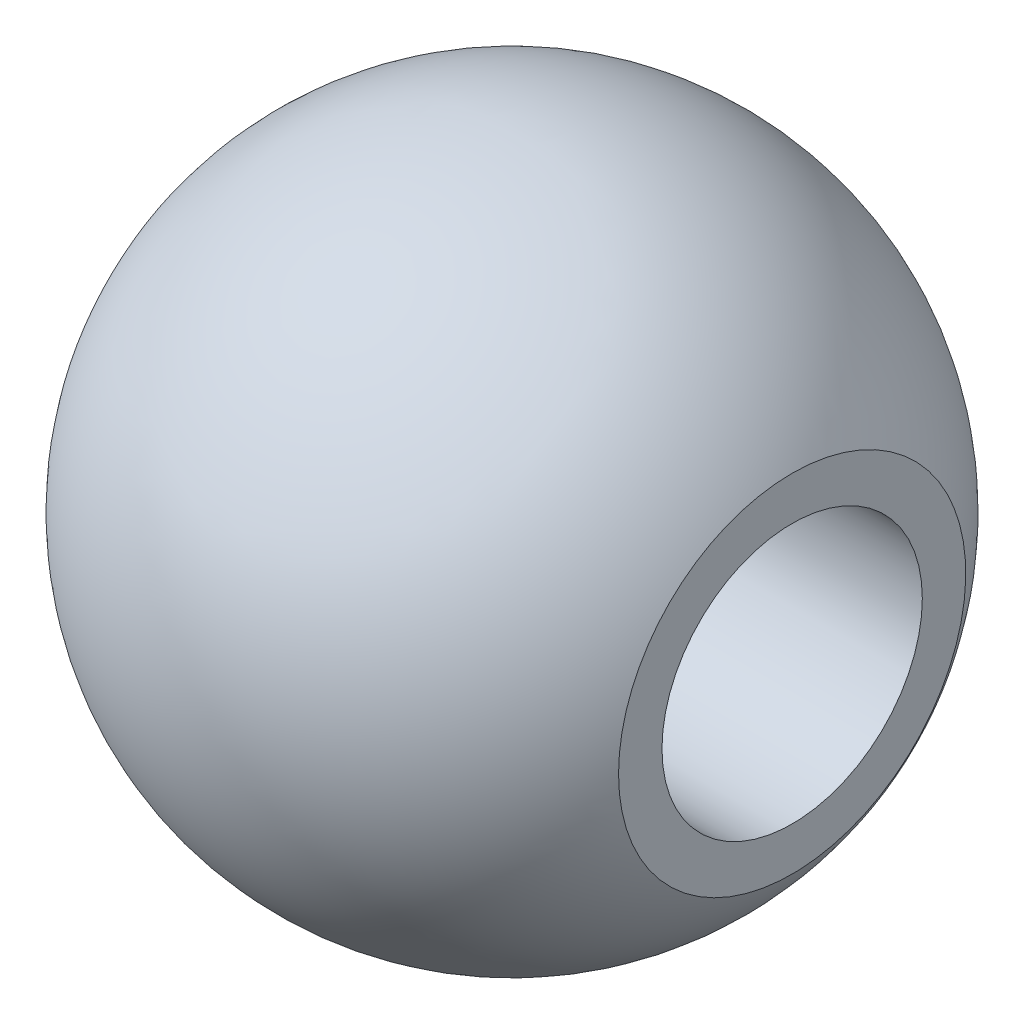
ISO-10303-21;
HEADER;
FILE_DESCRIPTION(('STEP AP214'),'2;1');
FILE_NAME('part.step','',(''),(''),'','','');
FILE_SCHEMA(('AUTOMOTIVE_DESIGN { 1 0 10303 214 1 1 1 1 }'));
ENDSEC;
DATA;
#1=APPLICATION_CONTEXT('core data for automotive mechanical design processes');
#2=APPLICATION_PROTOCOL_DEFINITION('international standard','automotive_design',2000,#1);
#3=PRODUCT_CONTEXT('',#1,'mechanical');
#4=PRODUCT('Part','Part','',(#3));
#5=PRODUCT_RELATED_PRODUCT_CATEGORY('part','',(#4));
#6=PRODUCT_DEFINITION_FORMATION('','',#4);
#7=PRODUCT_DEFINITION_CONTEXT('part definition',#1,'design');
#8=PRODUCT_DEFINITION('design','',#6,#7);
#9=PRODUCT_DEFINITION_SHAPE('','',#8);
#10=(LENGTH_UNIT() NAMED_UNIT(*) SI_UNIT(.MILLI.,.METRE.));
#11=(NAMED_UNIT(*) PLANE_ANGLE_UNIT() SI_UNIT($,.RADIAN.));
#12=(NAMED_UNIT(*) SI_UNIT($,.STERADIAN.) SOLID_ANGLE_UNIT());
#13=UNCERTAINTY_MEASURE_WITH_UNIT(LENGTH_MEASURE(1.E-05),#10,'distance_accuracy_value','');
#14=(GEOMETRIC_REPRESENTATION_CONTEXT(3) GLOBAL_UNCERTAINTY_ASSIGNED_CONTEXT((#13)) GLOBAL_UNIT_ASSIGNED_CONTEXT((#10,
#11,#12)) REPRESENTATION_CONTEXT('',''));
#15=CARTESIAN_POINT('',(0.,0.,0.));
#16=DIRECTION('',(0.,0.,1.));
#17=DIRECTION('',(1.,0.,0.));
#18=AXIS2_PLACEMENT_3D('',#15,#16,#17);
#19=CARTESIAN_POINT('',(25.4,0.,0.));
#20=DIRECTION('',(-1.,0.,0.));
#21=DIRECTION('',(0.,1.,0.));
#22=AXIS2_PLACEMENT_3D('',#19,#20,#21);
#23=SPHERICAL_SURFACE('',#22,25.4);
#24=CARTESIAN_POINT('',(46.99,0.,0.));
#25=DIRECTION('',(-1.,0.,0.));
#26=DIRECTION('',(0.,0.,1.));
#27=AXIS2_PLACEMENT_3D('',#24,#25,#26);
#28=CIRCLE('',#27,13.380280266123);
#29=CARTESIAN_POINT('',(46.99,0.,13.380280266123));
#30=VERTEX_POINT('',#29);
#31=EDGE_CURVE('E10',#30,#30,#28,.T.);
#32=ORIENTED_EDGE('',*,*,#31,.T.);
#33=EDGE_LOOP('',(#32));
#34=FACE_BOUND('',#33,.T.);
#35=ADVANCED_FACE('F41',(#34),#23,.T.);
#36=CARTESIAN_POINT('',(46.99,13.380280266123,0.));
#37=DIRECTION('',(-1.,0.,0.));
#38=DIRECTION('',(0.,0.,1.));
#39=AXIS2_PLACEMENT_3D('',#36,#37,#38);
#40=PLANE('',#39);
#41=ORIENTED_EDGE('',*,*,#31,.F.);
#42=EDGE_LOOP('',(#41));
#43=FACE_BOUND('',#42,.T.);
#44=CARTESIAN_POINT('',(46.99,0.,0.));
#45=DIRECTION('',(-1.,0.,0.));
#46=DIRECTION('',(0.,0.,1.));
#47=AXIS2_PLACEMENT_3D('',#44,#45,#46);
#48=CIRCLE('',#47,10.033);
#49=CARTESIAN_POINT('',(46.99,0.,10.033));
#50=VERTEX_POINT('',#49);
#51=EDGE_CURVE('E48',#50,#50,#48,.T.);
#52=ORIENTED_EDGE('',*,*,#51,.T.);
#53=EDGE_LOOP('',(#52));
#54=FACE_BOUND('',#53,.T.);
#55=ADVANCED_FACE('F81',(#43,#54),#40,.F.);
#56=CARTESIAN_POINT('',(0.,0.,0.));
#57=DIRECTION('',(-1.,0.,0.));
#58=DIRECTION('',(0.,0.,1.));
#59=AXIS2_PLACEMENT_3D('',#56,#57,#58);
#60=CYLINDRICAL_SURFACE('',#59,10.033);
#61=ORIENTED_EDGE('',*,*,#51,.F.);
#62=EDGE_LOOP('',(#61));
#63=FACE_BOUND('',#62,.T.);
#64=CARTESIAN_POINT('',(13.49375,0.,0.));
#65=DIRECTION('',(-1.,0.,0.));
#66=DIRECTION('',(0.,0.,1.));
#67=AXIS2_PLACEMENT_3D('',#64,#65,#66);
#68=CIRCLE('',#67,10.033);
#69=CARTESIAN_POINT('',(13.49375,0.,10.033));
#70=VERTEX_POINT('',#69);
#71=EDGE_CURVE('E53',#70,#70,#68,.T.);
#72=ORIENTED_EDGE('',*,*,#71,.T.);
#73=EDGE_LOOP('',(#72));
#74=FACE_BOUND('',#73,.T.);
#75=ADVANCED_FACE('F85',(#63,#74),#60,.F.);
#76=CARTESIAN_POINT('',(12.7,0.,0.));
#77=DIRECTION('',(-1.,0.,0.));
#78=DIRECTION('',(0.,0.,1.));
#79=AXIS2_PLACEMENT_3D('',#76,#77,#78);
#80=TOROIDAL_SURFACE('',#79,10.033,0.793749999999999);
#81=ORIENTED_EDGE('',*,*,#71,.F.);
#82=EDGE_LOOP('',(#81));
#83=FACE_BOUND('',#82,.T.);
#84=CARTESIAN_POINT('',(11.90625,0.,0.));
#85=DIRECTION('',(-1.,0.,0.));
#86=DIRECTION('',(0.,0.,1.));
#87=AXIS2_PLACEMENT_3D('',#84,#85,#86);
#88=CIRCLE('',#87,10.033);
#89=CARTESIAN_POINT('',(11.90625,0.,10.033));
#90=VERTEX_POINT('',#89);
#91=EDGE_CURVE('E58',#90,#90,#88,.T.);
#92=ORIENTED_EDGE('',*,*,#91,.T.);
#93=EDGE_LOOP('',(#92));
#94=FACE_BOUND('',#93,.T.);
#95=ADVANCED_FACE('F77',(#83,#94),#80,.F.);
#96=CARTESIAN_POINT('',(0.,0.,0.));
#97=DIRECTION('',(-1.,0.,0.));
#98=DIRECTION('',(0.,0.,1.));
#99=AXIS2_PLACEMENT_3D('',#96,#97,#98);
#100=CYLINDRICAL_SURFACE('',#99,10.033);
#101=ORIENTED_EDGE('',*,*,#91,.F.);
#102=EDGE_LOOP('',(#101));
#103=FACE_BOUND('',#102,.T.);
#104=CARTESIAN_POINT('',(5.334,0.,0.));
#105=DIRECTION('',(-1.,0.,0.));
#106=DIRECTION('',(0.,0.,1.));
#107=AXIS2_PLACEMENT_3D('',#104,#105,#106);
#108=CIRCLE('',#107,10.033);
#109=CARTESIAN_POINT('',(5.334,0.,10.033));
#110=VERTEX_POINT('',#109);
#111=EDGE_CURVE('E64',#110,#110,#108,.T.);
#112=ORIENTED_EDGE('',*,*,#111,.T.);
#113=EDGE_LOOP('',(#112));
#114=FACE_BOUND('',#113,.T.);
#115=ADVANCED_FACE('F69',(#103,#114),#100,.F.);
#116=CARTESIAN_POINT('',(5.334,10.033,0.));
#117=DIRECTION('',(-1.,0.,0.));
#118=DIRECTION('',(0.,0.,1.));
#119=AXIS2_PLACEMENT_3D('',#116,#117,#118);
#120=PLANE('',#119);
#121=ORIENTED_EDGE('',*,*,#111,.F.);
#122=EDGE_LOOP('',(#121));
#123=FACE_BOUND('',#122,.T.);
#124=ADVANCED_FACE('F71',(#123),#120,.F.);
#125=CLOSED_SHELL('',(#35,#55,#75,#95,#115,#124));
#126=MANIFOLD_SOLID_BREP('B2',#125);
#127=ADVANCED_BREP_SHAPE_REPRESENTATION('',(#18,#126),#14);
#128=SHAPE_DEFINITION_REPRESENTATION(#9,#127);
ENDSEC;
END-ISO-10303-21;
